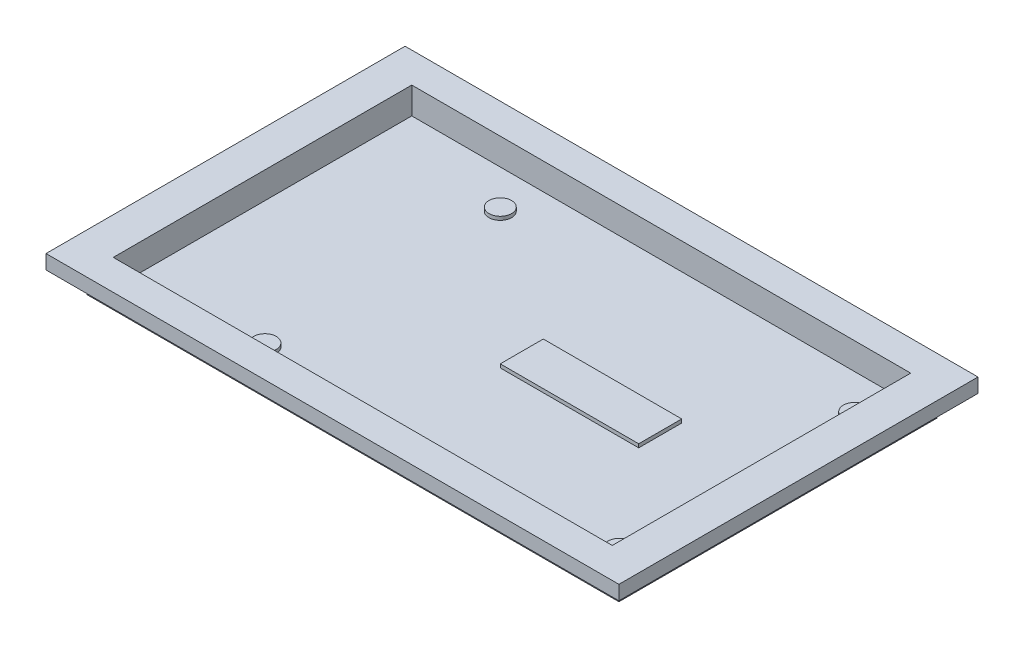
ISO-10303-21;
HEADER;
FILE_DESCRIPTION(('STEP AP214'),'2;1');
FILE_NAME('part.step','',(''),(''),'','','');
FILE_SCHEMA(('AUTOMOTIVE_DESIGN { 1 0 10303 214 1 1 1 1 }'));
ENDSEC;
DATA;
#1=APPLICATION_CONTEXT('core data for automotive mechanical design processes');
#2=APPLICATION_PROTOCOL_DEFINITION('international standard','automotive_design',2000,#1);
#3=PRODUCT_CONTEXT('',#1,'mechanical');
#4=PRODUCT('Part','Part','',(#3));
#5=PRODUCT_RELATED_PRODUCT_CATEGORY('part','',(#4));
#6=PRODUCT_DEFINITION_FORMATION('','',#4);
#7=PRODUCT_DEFINITION_CONTEXT('part definition',#1,'design');
#8=PRODUCT_DEFINITION('design','',#6,#7);
#9=PRODUCT_DEFINITION_SHAPE('','',#8);
#10=(LENGTH_UNIT() NAMED_UNIT(*) SI_UNIT(.MILLI.,.METRE.));
#11=(NAMED_UNIT(*) PLANE_ANGLE_UNIT() SI_UNIT($,.RADIAN.));
#12=(NAMED_UNIT(*) SI_UNIT($,.STERADIAN.) SOLID_ANGLE_UNIT());
#13=UNCERTAINTY_MEASURE_WITH_UNIT(LENGTH_MEASURE(1.E-05),#10,'distance_accuracy_value','');
#14=(GEOMETRIC_REPRESENTATION_CONTEXT(3) GLOBAL_UNCERTAINTY_ASSIGNED_CONTEXT((#13)) GLOBAL_UNIT_ASSIGNED_CONTEXT((#10,
#11,#12)) REPRESENTATION_CONTEXT('',''));
#15=CARTESIAN_POINT('',(0.,0.,0.));
#16=DIRECTION('',(0.,0.,1.));
#17=DIRECTION('',(1.,0.,0.));
#18=AXIS2_PLACEMENT_3D('',#15,#16,#17);
#19=CARTESIAN_POINT('',(0.,0.,0.));
#20=DIRECTION('',(0.,-1.,0.));
#21=DIRECTION('',(0.,0.,-1.));
#22=AXIS2_PLACEMENT_3D('',#19,#20,#21);
#23=PLANE('',#22);
#24=DIRECTION('',(0.,0.,1.));
#25=VECTOR('',#24,1.);
#26=CARTESIAN_POINT('',(2.3,0.,-40.3));
#27=LINE('',#26,#25);
#28=CARTESIAN_POINT('',(2.3,0.,-38.));
#29=VERTEX_POINT('',#28);
#30=CARTESIAN_POINT('',(2.3,0.,-2.3));
#31=VERTEX_POINT('',#30);
#32=EDGE_CURVE('E57',#29,#31,#27,.T.);
#33=ORIENTED_EDGE('',*,*,#32,.F.);
#34=DIRECTION('',(1.,0.,0.));
#35=VECTOR('',#34,1.);
#36=CARTESIAN_POINT('',(0.,0.,-38.));
#37=LINE('',#36,#35);
#38=CARTESIAN_POINT('',(62.,0.,-38.));
#39=VERTEX_POINT('',#38);
#40=EDGE_CURVE('E147',#29,#39,#37,.T.);
#41=ORIENTED_EDGE('',*,*,#40,.T.);
#42=DIRECTION('',(0.,0.,1.));
#43=VECTOR('',#42,1.);
#44=CARTESIAN_POINT('',(62.,0.,-40.3));
#45=LINE('',#44,#43);
#46=CARTESIAN_POINT('',(62.,0.,-2.3));
#47=VERTEX_POINT('',#46);
#48=EDGE_CURVE('E296',#39,#47,#45,.T.);
#49=ORIENTED_EDGE('',*,*,#48,.T.);
#50=DIRECTION('',(1.,0.,0.));
#51=VECTOR('',#50,1.);
#52=CARTESIAN_POINT('',(0.,0.,-2.3));
#53=LINE('',#52,#51);
#54=EDGE_CURVE('E160',#31,#47,#53,.T.);
#55=ORIENTED_EDGE('',*,*,#54,.F.);
#56=EDGE_LOOP('',(#33,#41,#49,#55));
#57=FACE_BOUND('',#56,.T.);
#58=ADVANCED_FACE('F34',(#57),#23,.T.);
#59=CARTESIAN_POINT('',(2.3,0.,-40.3));
#60=DIRECTION('',(1.,0.,0.));
#61=DIRECTION('',(0.,0.,-1.));
#62=AXIS2_PLACEMENT_3D('',#59,#60,#61);
#63=PLANE('',#62);
#64=DIRECTION('',(0.,1.,0.));
#65=VECTOR('',#64,1.);
#66=CARTESIAN_POINT('',(2.3,0.,-38.));
#67=LINE('',#66,#65);
#68=CARTESIAN_POINT('',(2.3,2.4,-38.));
#69=VERTEX_POINT('',#68);
#70=EDGE_CURVE('E149',#29,#69,#67,.T.);
#71=ORIENTED_EDGE('',*,*,#70,.F.);
#72=ORIENTED_EDGE('',*,*,#32,.T.);
#73=DIRECTION('',(0.,1.,0.));
#74=VECTOR('',#73,1.);
#75=CARTESIAN_POINT('',(2.3,0.,-2.3));
#76=LINE('',#75,#74);
#77=CARTESIAN_POINT('',(2.3,2.4,-2.3));
#78=VERTEX_POINT('',#77);
#79=EDGE_CURVE('E177',#31,#78,#76,.T.);
#80=ORIENTED_EDGE('',*,*,#79,.T.);
#81=DIRECTION('',(0.,0.,1.));
#82=VECTOR('',#81,1.);
#83=CARTESIAN_POINT('',(2.3,2.4,-40.3));
#84=LINE('',#83,#82);
#85=EDGE_CURVE('E156',#69,#78,#84,.T.);
#86=ORIENTED_EDGE('',*,*,#85,.F.);
#87=EDGE_LOOP('',(#71,#72,#80,#86));
#88=FACE_BOUND('',#87,.T.);
#89=ADVANCED_FACE('F155',(#88),#63,.F.);
#90=CARTESIAN_POINT('',(62.,0.,-40.3));
#91=DIRECTION('',(1.,0.,0.));
#92=DIRECTION('',(0.,0.,-1.));
#93=AXIS2_PLACEMENT_3D('',#90,#91,#92);
#94=PLANE('',#93);
#95=ORIENTED_EDGE('',*,*,#48,.F.);
#96=DIRECTION('',(0.,1.,0.));
#97=VECTOR('',#96,1.);
#98=CARTESIAN_POINT('',(62.,0.,-38.));
#99=LINE('',#98,#97);
#100=CARTESIAN_POINT('',(62.,2.4,-38.));
#101=VERTEX_POINT('',#100);
#102=EDGE_CURVE('E151',#39,#101,#99,.T.);
#103=ORIENTED_EDGE('',*,*,#102,.T.);
#104=DIRECTION('',(0.,0.,1.));
#105=VECTOR('',#104,1.);
#106=CARTESIAN_POINT('',(62.,2.4,-40.3));
#107=LINE('',#106,#105);
#108=CARTESIAN_POINT('',(62.,2.4,-2.3));
#109=VERTEX_POINT('',#108);
#110=EDGE_CURVE('E165',#101,#109,#107,.T.);
#111=ORIENTED_EDGE('',*,*,#110,.T.);
#112=DIRECTION('',(0.,1.,0.));
#113=VECTOR('',#112,1.);
#114=CARTESIAN_POINT('',(62.,0.,-2.3));
#115=LINE('',#114,#113);
#116=EDGE_CURVE('E170',#47,#109,#115,.T.);
#117=ORIENTED_EDGE('',*,*,#116,.F.);
#118=EDGE_LOOP('',(#95,#103,#111,#117));
#119=FACE_BOUND('',#118,.T.);
#120=ADVANCED_FACE('F344',(#119),#94,.T.);
#121=CARTESIAN_POINT('',(0.,4.,0.));
#122=DIRECTION('',(0.,0.,-1.));
#123=DIRECTION('',(-1.,0.,0.));
#124=AXIS2_PLACEMENT_3D('',#121,#122,#123);
#125=PLANE('',#124);
#126=DIRECTION('',(1.,0.,0.));
#127=VECTOR('',#126,1.);
#128=CARTESIAN_POINT('',(0.,2.4,0.));
#129=LINE('',#128,#127);
#130=CARTESIAN_POINT('',(0.,2.4,0.));
#131=VERTEX_POINT('',#130);
#132=CARTESIAN_POINT('',(64.3,2.4,0.));
#133=VERTEX_POINT('',#132);
#134=EDGE_CURVE('E171',#131,#133,#129,.T.);
#135=ORIENTED_EDGE('',*,*,#134,.T.);
#136=DIRECTION('',(0.,-1.,0.));
#137=VECTOR('',#136,1.);
#138=CARTESIAN_POINT('',(64.3,4.,0.));
#139=LINE('',#138,#137);
#140=CARTESIAN_POINT('',(64.3,4.,0.));
#141=VERTEX_POINT('',#140);
#142=EDGE_CURVE('E42',#141,#133,#139,.T.);
#143=ORIENTED_EDGE('',*,*,#142,.F.);
#144=DIRECTION('',(1.,0.,0.));
#145=VECTOR('',#144,1.);
#146=CARTESIAN_POINT('',(0.,4.,0.));
#147=LINE('',#146,#145);
#148=CARTESIAN_POINT('',(0.,4.,0.));
#149=VERTEX_POINT('',#148);
#150=EDGE_CURVE('E269',#149,#141,#147,.T.);
#151=ORIENTED_EDGE('',*,*,#150,.F.);
#152=DIRECTION('',(0.,-1.,0.));
#153=VECTOR('',#152,1.);
#154=CARTESIAN_POINT('',(0.,4.,0.));
#155=LINE('',#154,#153);
#156=EDGE_CURVE('E11',#149,#131,#155,.T.);
#157=ORIENTED_EDGE('',*,*,#156,.T.);
#158=EDGE_LOOP('',(#135,#143,#151,#157));
#159=FACE_BOUND('',#158,.T.);
#160=ADVANCED_FACE('F290',(#159),#125,.F.);
#161=CARTESIAN_POINT('',(0.,4.,-40.3));
#162=DIRECTION('',(0.,0.,1.));
#163=DIRECTION('',(1.,0.,0.));
#164=AXIS2_PLACEMENT_3D('',#161,#162,#163);
#165=PLANE('',#164);
#166=DIRECTION('',(0.,-1.,0.));
#167=VECTOR('',#166,1.);
#168=CARTESIAN_POINT('',(64.3,4.,-40.3));
#169=LINE('',#168,#167);
#170=CARTESIAN_POINT('',(64.3,4.,-40.3));
#171=VERTEX_POINT('',#170);
#172=CARTESIAN_POINT('',(64.3,2.4,-40.3));
#173=VERTEX_POINT('',#172);
#174=EDGE_CURVE('E278',#171,#173,#169,.T.);
#175=ORIENTED_EDGE('',*,*,#174,.T.);
#176=DIRECTION('',(1.,0.,0.));
#177=VECTOR('',#176,1.);
#178=CARTESIAN_POINT('',(0.,2.4,-40.3));
#179=LINE('',#178,#177);
#180=CARTESIAN_POINT('',(0.,2.4,-40.3));
#181=VERTEX_POINT('',#180);
#182=EDGE_CURVE('E161',#181,#173,#179,.T.);
#183=ORIENTED_EDGE('',*,*,#182,.F.);
#184=DIRECTION('',(0.,-1.,0.));
#185=VECTOR('',#184,1.);
#186=CARTESIAN_POINT('',(0.,4.,-40.3));
#187=LINE('',#186,#185);
#188=CARTESIAN_POINT('',(0.,4.,-40.3));
#189=VERTEX_POINT('',#188);
#190=EDGE_CURVE('E275',#189,#181,#187,.T.);
#191=ORIENTED_EDGE('',*,*,#190,.F.);
#192=DIRECTION('',(-1.,0.,0.));
#193=VECTOR('',#192,1.);
#194=CARTESIAN_POINT('',(0.,4.,-40.3));
#195=LINE('',#194,#193);
#196=EDGE_CURVE('E273',#171,#189,#195,.T.);
#197=ORIENTED_EDGE('',*,*,#196,.F.);
#198=EDGE_LOOP('',(#175,#183,#191,#197));
#199=FACE_BOUND('',#198,.T.);
#200=ADVANCED_FACE('F305',(#199),#165,.F.);
#201=CARTESIAN_POINT('',(64.3,4.,0.));
#202=DIRECTION('',(-1.,0.,0.));
#203=DIRECTION('',(0.,0.,1.));
#204=AXIS2_PLACEMENT_3D('',#201,#202,#203);
#205=PLANE('',#204);
#206=DIRECTION('',(0.,0.,1.));
#207=VECTOR('',#206,1.);
#208=CARTESIAN_POINT('',(64.3,2.4,-40.3));
#209=LINE('',#208,#207);
#210=EDGE_CURVE('E288',#173,#133,#209,.T.);
#211=ORIENTED_EDGE('',*,*,#210,.F.);
#212=ORIENTED_EDGE('',*,*,#174,.F.);
#213=DIRECTION('',(0.,0.,-1.));
#214=VECTOR('',#213,1.);
#215=CARTESIAN_POINT('',(64.3,4.,0.));
#216=LINE('',#215,#214);
#217=EDGE_CURVE('E271',#141,#171,#216,.T.);
#218=ORIENTED_EDGE('',*,*,#217,.F.);
#219=ORIENTED_EDGE('',*,*,#142,.T.);
#220=EDGE_LOOP('',(#211,#212,#218,#219));
#221=FACE_BOUND('',#220,.T.);
#222=ADVANCED_FACE('F285',(#221),#205,.F.);
#223=CARTESIAN_POINT('',(0.,4.,0.));
#224=DIRECTION('',(1.,0.,0.));
#225=DIRECTION('',(0.,0.,-1.));
#226=AXIS2_PLACEMENT_3D('',#223,#224,#225);
#227=PLANE('',#226);
#228=DIRECTION('',(0.,0.,1.));
#229=VECTOR('',#228,1.);
#230=CARTESIAN_POINT('',(0.,2.4,-40.3));
#231=LINE('',#230,#229);
#232=EDGE_CURVE('E163',#181,#131,#231,.T.);
#233=ORIENTED_EDGE('',*,*,#232,.T.);
#234=ORIENTED_EDGE('',*,*,#156,.F.);
#235=DIRECTION('',(0.,0.,1.));
#236=VECTOR('',#235,1.);
#237=CARTESIAN_POINT('',(0.,4.,0.));
#238=LINE('',#237,#236);
#239=EDGE_CURVE('E260',#189,#149,#238,.T.);
#240=ORIENTED_EDGE('',*,*,#239,.F.);
#241=ORIENTED_EDGE('',*,*,#190,.T.);
#242=EDGE_LOOP('',(#233,#234,#240,#241));
#243=FACE_BOUND('',#242,.T.);
#244=ADVANCED_FACE('F36',(#243),#227,.F.);
#245=CARTESIAN_POINT('',(0.,1.,0.));
#246=DIRECTION('',(0.,1.,0.));
#247=DIRECTION('',(0.,0.,1.));
#248=AXIS2_PLACEMENT_3D('',#245,#246,#247);
#249=PLANE('',#248);
#250=CARTESIAN_POINT('',(58.15,1.,-32.61));
#251=DIRECTION('',(0.,1.,0.));
#252=DIRECTION('',(0.,0.,1.));
#253=AXIS2_PLACEMENT_3D('',#250,#251,#252);
#254=CIRCLE('',#253,1.27);
#255=CARTESIAN_POINT('',(58.15,1.,-31.34));
#256=VERTEX_POINT('',#255);
#257=EDGE_CURVE('E209',#256,#256,#254,.T.);
#258=ORIENTED_EDGE('',*,*,#257,.F.);
#259=EDGE_LOOP('',(#258));
#260=FACE_BOUND('',#259,.T.);
#261=CARTESIAN_POINT('',(58.15,1.,-6.194));
#262=DIRECTION('',(0.,1.,0.));
#263=DIRECTION('',(0.,0.,1.));
#264=AXIS2_PLACEMENT_3D('',#261,#262,#263);
#265=CIRCLE('',#264,1.27);
#266=CARTESIAN_POINT('',(58.15,1.,-4.924));
#267=VERTEX_POINT('',#266);
#268=EDGE_CURVE('E213',#267,#267,#265,.T.);
#269=ORIENTED_EDGE('',*,*,#268,.F.);
#270=EDGE_LOOP('',(#269));
#271=FACE_BOUND('',#270,.T.);
#272=CARTESIAN_POINT('',(18.374,1.,-6.194));
#273=DIRECTION('',(0.,1.,0.));
#274=DIRECTION('',(0.,0.,1.));
#275=AXIS2_PLACEMENT_3D('',#272,#273,#274);
#276=CIRCLE('',#275,1.27);
#277=CARTESIAN_POINT('',(18.374,1.,-4.924));
#278=VERTEX_POINT('',#277);
#279=EDGE_CURVE('E219',#278,#278,#276,.T.);
#280=ORIENTED_EDGE('',*,*,#279,.F.);
#281=EDGE_LOOP('',(#280));
#282=FACE_BOUND('',#281,.T.);
#283=CARTESIAN_POINT('',(18.374,1.,-32.61));
#284=DIRECTION('',(0.,1.,0.));
#285=DIRECTION('',(0.,0.,1.));
#286=AXIS2_PLACEMENT_3D('',#283,#284,#285);
#287=CIRCLE('',#286,1.27);
#288=CARTESIAN_POINT('',(18.374,1.,-31.34));
#289=VERTEX_POINT('',#288);
#290=EDGE_CURVE('E225',#289,#289,#287,.T.);
#291=ORIENTED_EDGE('',*,*,#290,.F.);
#292=EDGE_LOOP('',(#291));
#293=FACE_BOUND('',#292,.T.);
#294=DIRECTION('',(1.,0.,0.));
#295=VECTOR('',#294,1.);
#296=CARTESIAN_POINT('',(0.,1.,-36.9));
#297=LINE('',#296,#295);
#298=CARTESIAN_POINT('',(4.14999999999999,1.,-36.9));
#299=VERTEX_POINT('',#298);
#300=CARTESIAN_POINT('',(60.15,1.,-36.9));
#301=VERTEX_POINT('',#300);
#302=EDGE_CURVE('E234',#299,#301,#297,.T.);
#303=ORIENTED_EDGE('',*,*,#302,.F.);
#304=DIRECTION('',(0.,0.,1.));
#305=VECTOR('',#304,1.);
#306=CARTESIAN_POINT('',(4.15,1.,0.));
#307=LINE('',#306,#305);
#308=CARTESIAN_POINT('',(4.15,1.,-3.4));
#309=VERTEX_POINT('',#308);
#310=EDGE_CURVE('E237',#299,#309,#307,.T.);
#311=ORIENTED_EDGE('',*,*,#310,.T.);
#312=DIRECTION('',(1.,0.,0.));
#313=VECTOR('',#312,1.);
#314=CARTESIAN_POINT('',(0.,1.,-3.4));
#315=LINE('',#314,#313);
#316=CARTESIAN_POINT('',(60.15,1.,-3.4));
#317=VERTEX_POINT('',#316);
#318=EDGE_CURVE('E241',#309,#317,#315,.T.);
#319=ORIENTED_EDGE('',*,*,#318,.T.);
#320=DIRECTION('',(0.,0.,1.));
#321=VECTOR('',#320,1.);
#322=CARTESIAN_POINT('',(60.15,1.,0.));
#323=LINE('',#322,#321);
#324=EDGE_CURVE('E244',#301,#317,#323,.T.);
#325=ORIENTED_EDGE('',*,*,#324,.F.);
#326=EDGE_LOOP('',(#303,#311,#319,#325));
#327=FACE_BOUND('',#326,.T.);
#328=DIRECTION('',(1.,0.,0.));
#329=VECTOR('',#328,1.);
#330=CARTESIAN_POINT('',(33.614,1.,-17.37));
#331=LINE('',#330,#329);
#332=CARTESIAN_POINT('',(33.614,1.,-17.37));
#333=VERTEX_POINT('',#332);
#334=CARTESIAN_POINT('',(49.15,1.,-17.37));
#335=VERTEX_POINT('',#334);
#336=EDGE_CURVE('E194',#333,#335,#331,.T.);
#337=ORIENTED_EDGE('',*,*,#336,.F.);
#338=DIRECTION('',(0.,0.,1.));
#339=VECTOR('',#338,1.);
#340=CARTESIAN_POINT('',(33.614,1.,-22.196));
#341=LINE('',#340,#339);
#342=CARTESIAN_POINT('',(33.614,1.,-22.196));
#343=VERTEX_POINT('',#342);
#344=EDGE_CURVE('E179',#343,#333,#341,.T.);
#345=ORIENTED_EDGE('',*,*,#344,.F.);
#346=DIRECTION('',(-1.,0.,0.));
#347=VECTOR('',#346,1.);
#348=CARTESIAN_POINT('',(33.614,1.,-22.196));
#349=LINE('',#348,#347);
#350=CARTESIAN_POINT('',(49.15,1.,-22.196));
#351=VERTEX_POINT('',#350);
#352=EDGE_CURVE('E185',#351,#343,#349,.T.);
#353=ORIENTED_EDGE('',*,*,#352,.F.);
#354=DIRECTION('',(0.,0.,-1.));
#355=VECTOR('',#354,1.);
#356=CARTESIAN_POINT('',(49.15,1.,-22.196));
#357=LINE('',#356,#355);
#358=EDGE_CURVE('E196',#335,#351,#357,.T.);
#359=ORIENTED_EDGE('',*,*,#358,.F.);
#360=EDGE_LOOP('',(#337,#345,#353,#359));
#361=FACE_BOUND('',#360,.T.);
#362=ADVANCED_FACE('F312',(#260,#271,#282,#293,#327,#361),#249,.T.);
#363=CARTESIAN_POINT('',(0.,4.,0.));
#364=DIRECTION('',(0.,-1.,0.));
#365=DIRECTION('',(0.,0.,-1.));
#366=AXIS2_PLACEMENT_3D('',#363,#364,#365);
#367=PLANE('',#366);
#368=ORIENTED_EDGE('',*,*,#239,.T.);
#369=ORIENTED_EDGE('',*,*,#150,.T.);
#370=ORIENTED_EDGE('',*,*,#217,.T.);
#371=ORIENTED_EDGE('',*,*,#196,.T.);
#372=EDGE_LOOP('',(#368,#369,#370,#371));
#373=FACE_BOUND('',#372,.T.);
#374=DIRECTION('',(1.,0.,0.));
#375=VECTOR('',#374,1.);
#376=CARTESIAN_POINT('',(0.,4.,-36.9));
#377=LINE('',#376,#375);
#378=CARTESIAN_POINT('',(4.14999999999999,4.,-36.9));
#379=VERTEX_POINT('',#378);
#380=CARTESIAN_POINT('',(60.15,4.,-36.9));
#381=VERTEX_POINT('',#380);
#382=EDGE_CURVE('E231',#379,#381,#377,.T.);
#383=ORIENTED_EDGE('',*,*,#382,.T.);
#384=DIRECTION('',(0.,0.,1.));
#385=VECTOR('',#384,1.);
#386=CARTESIAN_POINT('',(60.15,4.,0.));
#387=LINE('',#386,#385);
#388=CARTESIAN_POINT('',(60.15,4.,-3.4));
#389=VERTEX_POINT('',#388);
#390=EDGE_CURVE('E238',#381,#389,#387,.T.);
#391=ORIENTED_EDGE('',*,*,#390,.T.);
#392=DIRECTION('',(1.,0.,0.));
#393=VECTOR('',#392,1.);
#394=CARTESIAN_POINT('',(0.,4.,-3.4));
#395=LINE('',#394,#393);
#396=CARTESIAN_POINT('',(4.15,4.,-3.4));
#397=VERTEX_POINT('',#396);
#398=EDGE_CURVE('E252',#397,#389,#395,.T.);
#399=ORIENTED_EDGE('',*,*,#398,.F.);
#400=DIRECTION('',(0.,0.,1.));
#401=VECTOR('',#400,1.);
#402=CARTESIAN_POINT('',(4.15,4.,0.));
#403=LINE('',#402,#401);
#404=EDGE_CURVE('E249',#379,#397,#403,.T.);
#405=ORIENTED_EDGE('',*,*,#404,.F.);
#406=EDGE_LOOP('',(#383,#391,#399,#405));
#407=FACE_BOUND('',#406,.T.);
#408=ADVANCED_FACE('F308',(#373,#407),#367,.F.);
#409=CARTESIAN_POINT('',(0.,1.,-36.9));
#410=DIRECTION('',(0.,0.,1.));
#411=DIRECTION('',(1.,0.,0.));
#412=AXIS2_PLACEMENT_3D('',#409,#410,#411);
#413=PLANE('',#412);
#414=ORIENTED_EDGE('',*,*,#382,.F.);
#415=DIRECTION('',(0.,1.,0.));
#416=VECTOR('',#415,1.);
#417=CARTESIAN_POINT('',(4.14999999999999,1.,-36.9));
#418=LINE('',#417,#416);
#419=EDGE_CURVE('E246',#299,#379,#418,.T.);
#420=ORIENTED_EDGE('',*,*,#419,.F.);
#421=ORIENTED_EDGE('',*,*,#302,.T.);
#422=DIRECTION('',(0.,1.,0.));
#423=VECTOR('',#422,1.);
#424=CARTESIAN_POINT('',(60.15,1.,-36.9));
#425=LINE('',#424,#423);
#426=EDGE_CURVE('E257',#301,#381,#425,.T.);
#427=ORIENTED_EDGE('',*,*,#426,.T.);
#428=EDGE_LOOP('',(#414,#420,#421,#427));
#429=FACE_BOUND('',#428,.T.);
#430=ADVANCED_FACE('F311',(#429),#413,.T.);
#431=CARTESIAN_POINT('',(60.15,1.,0.));
#432=DIRECTION('',(-1.,0.,0.));
#433=DIRECTION('',(0.,0.,1.));
#434=AXIS2_PLACEMENT_3D('',#431,#432,#433);
#435=PLANE('',#434);
#436=ORIENTED_EDGE('',*,*,#390,.F.);
#437=ORIENTED_EDGE('',*,*,#426,.F.);
#438=ORIENTED_EDGE('',*,*,#324,.T.);
#439=DIRECTION('',(0.,1.,0.));
#440=VECTOR('',#439,1.);
#441=CARTESIAN_POINT('',(60.15,1.,-3.4));
#442=LINE('',#441,#440);
#443=EDGE_CURVE('E261',#317,#389,#442,.T.);
#444=ORIENTED_EDGE('',*,*,#443,.T.);
#445=EDGE_LOOP('',(#436,#437,#438,#444));
#446=FACE_BOUND('',#445,.T.);
#447=ADVANCED_FACE('F326',(#446),#435,.T.);
#448=CARTESIAN_POINT('',(0.,1.,-3.4));
#449=DIRECTION('',(0.,0.,1.));
#450=DIRECTION('',(1.,0.,0.));
#451=AXIS2_PLACEMENT_3D('',#448,#449,#450);
#452=PLANE('',#451);
#453=ORIENTED_EDGE('',*,*,#398,.T.);
#454=ORIENTED_EDGE('',*,*,#443,.F.);
#455=ORIENTED_EDGE('',*,*,#318,.F.);
#456=DIRECTION('',(0.,1.,0.));
#457=VECTOR('',#456,1.);
#458=CARTESIAN_POINT('',(4.15,1.,-3.4));
#459=LINE('',#458,#457);
#460=EDGE_CURVE('E263',#309,#397,#459,.T.);
#461=ORIENTED_EDGE('',*,*,#460,.T.);
#462=EDGE_LOOP('',(#453,#454,#455,#461));
#463=FACE_BOUND('',#462,.T.);
#464=ADVANCED_FACE('F329',(#463),#452,.F.);
#465=CARTESIAN_POINT('',(4.15,1.,0.));
#466=DIRECTION('',(-1.,0.,0.));
#467=DIRECTION('',(0.,0.,1.));
#468=AXIS2_PLACEMENT_3D('',#465,#466,#467);
#469=PLANE('',#468);
#470=ORIENTED_EDGE('',*,*,#404,.T.);
#471=ORIENTED_EDGE('',*,*,#460,.F.);
#472=ORIENTED_EDGE('',*,*,#310,.F.);
#473=ORIENTED_EDGE('',*,*,#419,.T.);
#474=EDGE_LOOP('',(#470,#471,#472,#473));
#475=FACE_BOUND('',#474,.T.);
#476=ADVANCED_FACE('F321',(#475),#469,.F.);
#477=CARTESIAN_POINT('',(18.374,1.4,-32.61));
#478=DIRECTION('',(0.,-1.,0.));
#479=DIRECTION('',(0.,0.,-1.));
#480=AXIS2_PLACEMENT_3D('',#477,#478,#479);
#481=CYLINDRICAL_SURFACE('',#480,1.27);
#482=CARTESIAN_POINT('',(18.374,1.4,-32.61));
#483=DIRECTION('',(0.,1.,0.));
#484=DIRECTION('',(0.,0.,1.));
#485=AXIS2_PLACEMENT_3D('',#482,#483,#484);
#486=CIRCLE('',#485,1.27);
#487=CARTESIAN_POINT('',(18.374,1.4,-31.34));
#488=VERTEX_POINT('',#487);
#489=EDGE_CURVE('E228',#488,#488,#486,.T.);
#490=ORIENTED_EDGE('',*,*,#489,.F.);
#491=EDGE_LOOP('',(#490));
#492=FACE_BOUND('',#491,.T.);
#493=ORIENTED_EDGE('',*,*,#290,.T.);
#494=EDGE_LOOP('',(#493));
#495=FACE_BOUND('',#494,.T.);
#496=ADVANCED_FACE('F336',(#492,#495),#481,.T.);
#497=CARTESIAN_POINT('',(18.374,1.4,-32.61));
#498=DIRECTION('',(0.,1.,0.));
#499=DIRECTION('',(0.,0.,1.));
#500=AXIS2_PLACEMENT_3D('',#497,#498,#499);
#501=PLANE('',#500);
#502=ORIENTED_EDGE('',*,*,#489,.T.);
#503=EDGE_LOOP('',(#502));
#504=FACE_BOUND('',#503,.T.);
#505=ADVANCED_FACE('F411',(#504),#501,.T.);
#506=CARTESIAN_POINT('',(18.374,1.4,-6.194));
#507=DIRECTION('',(0.,-1.,0.));
#508=DIRECTION('',(0.,0.,-1.));
#509=AXIS2_PLACEMENT_3D('',#506,#507,#508);
#510=CYLINDRICAL_SURFACE('',#509,1.27);
#511=CARTESIAN_POINT('',(18.374,1.4,-6.194));
#512=DIRECTION('',(0.,1.,0.));
#513=DIRECTION('',(0.,0.,1.));
#514=AXIS2_PLACEMENT_3D('',#511,#512,#513);
#515=CIRCLE('',#514,1.27);
#516=CARTESIAN_POINT('',(18.374,1.4,-4.924));
#517=VERTEX_POINT('',#516);
#518=EDGE_CURVE('E222',#517,#517,#515,.T.);
#519=ORIENTED_EDGE('',*,*,#518,.F.);
#520=EDGE_LOOP('',(#519));
#521=FACE_BOUND('',#520,.T.);
#522=ORIENTED_EDGE('',*,*,#279,.T.);
#523=EDGE_LOOP('',(#522));
#524=FACE_BOUND('',#523,.T.);
#525=ADVANCED_FACE('F407',(#521,#524),#510,.T.);
#526=CARTESIAN_POINT('',(18.374,1.4,-6.194));
#527=DIRECTION('',(0.,1.,0.));
#528=DIRECTION('',(0.,0.,1.));
#529=AXIS2_PLACEMENT_3D('',#526,#527,#528);
#530=PLANE('',#529);
#531=ORIENTED_EDGE('',*,*,#518,.T.);
#532=EDGE_LOOP('',(#531));
#533=FACE_BOUND('',#532,.T.);
#534=ADVANCED_FACE('F403',(#533),#530,.T.);
#535=CARTESIAN_POINT('',(58.15,1.4,-6.194));
#536=DIRECTION('',(0.,-1.,0.));
#537=DIRECTION('',(0.,0.,-1.));
#538=AXIS2_PLACEMENT_3D('',#535,#536,#537);
#539=CYLINDRICAL_SURFACE('',#538,1.27);
#540=CARTESIAN_POINT('',(58.15,1.4,-6.194));
#541=DIRECTION('',(0.,1.,0.));
#542=DIRECTION('',(0.,0.,1.));
#543=AXIS2_PLACEMENT_3D('',#540,#541,#542);
#544=CIRCLE('',#543,1.27);
#545=CARTESIAN_POINT('',(58.15,1.4,-4.924));
#546=VERTEX_POINT('',#545);
#547=EDGE_CURVE('E216',#546,#546,#544,.T.);
#548=ORIENTED_EDGE('',*,*,#547,.F.);
#549=EDGE_LOOP('',(#548));
#550=FACE_BOUND('',#549,.T.);
#551=ORIENTED_EDGE('',*,*,#268,.T.);
#552=EDGE_LOOP('',(#551));
#553=FACE_BOUND('',#552,.T.);
#554=ADVANCED_FACE('F399',(#550,#553),#539,.T.);
#555=CARTESIAN_POINT('',(58.15,1.4,-6.194));
#556=DIRECTION('',(0.,1.,0.));
#557=DIRECTION('',(0.,0.,1.));
#558=AXIS2_PLACEMENT_3D('',#555,#556,#557);
#559=PLANE('',#558);
#560=ORIENTED_EDGE('',*,*,#547,.T.);
#561=EDGE_LOOP('',(#560));
#562=FACE_BOUND('',#561,.T.);
#563=ADVANCED_FACE('F395',(#562),#559,.T.);
#564=CARTESIAN_POINT('',(58.15,1.4,-32.61));
#565=DIRECTION('',(0.,-1.,0.));
#566=DIRECTION('',(0.,0.,-1.));
#567=AXIS2_PLACEMENT_3D('',#564,#565,#566);
#568=CYLINDRICAL_SURFACE('',#567,1.27);
#569=CARTESIAN_POINT('',(58.15,1.4,-32.61));
#570=DIRECTION('',(0.,1.,0.));
#571=DIRECTION('',(0.,0.,1.));
#572=AXIS2_PLACEMENT_3D('',#569,#570,#571);
#573=CIRCLE('',#572,1.27);
#574=CARTESIAN_POINT('',(58.15,1.4,-31.34));
#575=VERTEX_POINT('',#574);
#576=EDGE_CURVE('E210',#575,#575,#573,.T.);
#577=ORIENTED_EDGE('',*,*,#576,.F.);
#578=EDGE_LOOP('',(#577));
#579=FACE_BOUND('',#578,.T.);
#580=ORIENTED_EDGE('',*,*,#257,.T.);
#581=EDGE_LOOP('',(#580));
#582=FACE_BOUND('',#581,.T.);
#583=ADVANCED_FACE('F391',(#579,#582),#568,.T.);
#584=CARTESIAN_POINT('',(58.15,1.4,-32.61));
#585=DIRECTION('',(0.,1.,0.));
#586=DIRECTION('',(0.,0.,1.));
#587=AXIS2_PLACEMENT_3D('',#584,#585,#586);
#588=PLANE('',#587);
#589=ORIENTED_EDGE('',*,*,#576,.T.);
#590=EDGE_LOOP('',(#589));
#591=FACE_BOUND('',#590,.T.);
#592=ADVANCED_FACE('F387',(#591),#588,.T.);
#593=CARTESIAN_POINT('',(33.614,1.4,-22.196));
#594=DIRECTION('',(1.,0.,0.));
#595=DIRECTION('',(0.,0.,-1.));
#596=AXIS2_PLACEMENT_3D('',#593,#594,#595);
#597=PLANE('',#596);
#598=ORIENTED_EDGE('',*,*,#344,.T.);
#599=DIRECTION('',(0.,-1.,0.));
#600=VECTOR('',#599,1.);
#601=CARTESIAN_POINT('',(33.614,1.4,-17.37));
#602=LINE('',#601,#600);
#603=CARTESIAN_POINT('',(33.614,1.4,-17.37));
#604=VERTEX_POINT('',#603);
#605=EDGE_CURVE('E207',#604,#333,#602,.T.);
#606=ORIENTED_EDGE('',*,*,#605,.F.);
#607=DIRECTION('',(0.,0.,1.));
#608=VECTOR('',#607,1.);
#609=CARTESIAN_POINT('',(33.614,1.4,-22.196));
#610=LINE('',#609,#608);
#611=CARTESIAN_POINT('',(33.614,1.4,-22.196));
#612=VERTEX_POINT('',#611);
#613=EDGE_CURVE('E181',#612,#604,#610,.T.);
#614=ORIENTED_EDGE('',*,*,#613,.F.);
#615=DIRECTION('',(0.,-1.,0.));
#616=VECTOR('',#615,1.);
#617=CARTESIAN_POINT('',(33.614,1.4,-22.196));
#618=LINE('',#617,#616);
#619=EDGE_CURVE('E191',#612,#343,#618,.T.);
#620=ORIENTED_EDGE('',*,*,#619,.T.);
#621=EDGE_LOOP('',(#598,#606,#614,#620));
#622=FACE_BOUND('',#621,.T.);
#623=ADVANCED_FACE('F383',(#622),#597,.F.);
#624=CARTESIAN_POINT('',(33.614,1.4,-17.37));
#625=DIRECTION('',(0.,0.,-1.));
#626=DIRECTION('',(-1.,0.,0.));
#627=AXIS2_PLACEMENT_3D('',#624,#625,#626);
#628=PLANE('',#627);
#629=ORIENTED_EDGE('',*,*,#336,.T.);
#630=DIRECTION('',(0.,-1.,0.));
#631=VECTOR('',#630,1.);
#632=CARTESIAN_POINT('',(49.15,1.4,-17.37));
#633=LINE('',#632,#631);
#634=CARTESIAN_POINT('',(49.15,1.4,-17.37));
#635=VERTEX_POINT('',#634);
#636=EDGE_CURVE('E204',#635,#335,#633,.T.);
#637=ORIENTED_EDGE('',*,*,#636,.F.);
#638=DIRECTION('',(1.,0.,0.));
#639=VECTOR('',#638,1.);
#640=CARTESIAN_POINT('',(33.614,1.4,-17.37));
#641=LINE('',#640,#639);
#642=EDGE_CURVE('E184',#604,#635,#641,.T.);
#643=ORIENTED_EDGE('',*,*,#642,.F.);
#644=ORIENTED_EDGE('',*,*,#605,.T.);
#645=EDGE_LOOP('',(#629,#637,#643,#644));
#646=FACE_BOUND('',#645,.T.);
#647=ADVANCED_FACE('F379',(#646),#628,.F.);
#648=CARTESIAN_POINT('',(49.15,1.4,-22.196));
#649=DIRECTION('',(-1.,0.,0.));
#650=DIRECTION('',(0.,0.,1.));
#651=AXIS2_PLACEMENT_3D('',#648,#649,#650);
#652=PLANE('',#651);
#653=ORIENTED_EDGE('',*,*,#358,.T.);
#654=DIRECTION('',(0.,-1.,0.));
#655=VECTOR('',#654,1.);
#656=CARTESIAN_POINT('',(49.15,1.4,-22.196));
#657=LINE('',#656,#655);
#658=CARTESIAN_POINT('',(49.15,1.4,-22.196));
#659=VERTEX_POINT('',#658);
#660=EDGE_CURVE('E202',#659,#351,#657,.T.);
#661=ORIENTED_EDGE('',*,*,#660,.F.);
#662=DIRECTION('',(0.,0.,-1.));
#663=VECTOR('',#662,1.);
#664=CARTESIAN_POINT('',(49.15,1.4,-22.196));
#665=LINE('',#664,#663);
#666=EDGE_CURVE('E187',#635,#659,#665,.T.);
#667=ORIENTED_EDGE('',*,*,#666,.F.);
#668=ORIENTED_EDGE('',*,*,#636,.T.);
#669=EDGE_LOOP('',(#653,#661,#667,#668));
#670=FACE_BOUND('',#669,.T.);
#671=ADVANCED_FACE('F375',(#670),#652,.F.);
#672=CARTESIAN_POINT('',(33.614,1.4,-22.196));
#673=DIRECTION('',(0.,0.,1.));
#674=DIRECTION('',(1.,0.,0.));
#675=AXIS2_PLACEMENT_3D('',#672,#673,#674);
#676=PLANE('',#675);
#677=ORIENTED_EDGE('',*,*,#352,.T.);
#678=ORIENTED_EDGE('',*,*,#619,.F.);
#679=DIRECTION('',(-1.,0.,0.));
#680=VECTOR('',#679,1.);
#681=CARTESIAN_POINT('',(33.614,1.4,-22.196));
#682=LINE('',#681,#680);
#683=EDGE_CURVE('E189',#659,#612,#682,.T.);
#684=ORIENTED_EDGE('',*,*,#683,.F.);
#685=ORIENTED_EDGE('',*,*,#660,.T.);
#686=EDGE_LOOP('',(#677,#678,#684,#685));
#687=FACE_BOUND('',#686,.T.);
#688=ADVANCED_FACE('F371',(#687),#676,.F.);
#689=CARTESIAN_POINT('',(0.,1.4,0.));
#690=DIRECTION('',(0.,1.,0.));
#691=DIRECTION('',(0.,0.,1.));
#692=AXIS2_PLACEMENT_3D('',#689,#690,#691);
#693=PLANE('',#692);
#694=ORIENTED_EDGE('',*,*,#613,.T.);
#695=ORIENTED_EDGE('',*,*,#642,.T.);
#696=ORIENTED_EDGE('',*,*,#666,.T.);
#697=ORIENTED_EDGE('',*,*,#683,.T.);
#698=EDGE_LOOP('',(#694,#695,#696,#697));
#699=FACE_BOUND('',#698,.T.);
#700=ADVANCED_FACE('F367',(#699),#693,.T.);
#701=CARTESIAN_POINT('',(0.,2.4,-2.3));
#702=DIRECTION('',(0.,-1.,0.));
#703=DIRECTION('',(0.,0.,-1.));
#704=AXIS2_PLACEMENT_3D('',#701,#702,#703);
#705=PLANE('',#704);
#706=DIRECTION('',(1.,0.,0.));
#707=VECTOR('',#706,1.);
#708=CARTESIAN_POINT('',(0.,2.4,-38.));
#709=LINE('',#708,#707);
#710=EDGE_CURVE('E49',#69,#101,#709,.T.);
#711=ORIENTED_EDGE('',*,*,#710,.F.);
#712=ORIENTED_EDGE('',*,*,#85,.T.);
#713=DIRECTION('',(1.,0.,0.));
#714=VECTOR('',#713,1.);
#715=CARTESIAN_POINT('',(0.,2.4,-2.3));
#716=LINE('',#715,#714);
#717=EDGE_CURVE('E174',#78,#109,#716,.T.);
#718=ORIENTED_EDGE('',*,*,#717,.T.);
#719=ORIENTED_EDGE('',*,*,#110,.F.);
#720=EDGE_LOOP('',(#711,#712,#718,#719));
#721=FACE_BOUND('',#720,.T.);
#722=ORIENTED_EDGE('',*,*,#134,.F.);
#723=ORIENTED_EDGE('',*,*,#232,.F.);
#724=ORIENTED_EDGE('',*,*,#182,.T.);
#725=ORIENTED_EDGE('',*,*,#210,.T.);
#726=EDGE_LOOP('',(#722,#723,#724,#725));
#727=FACE_BOUND('',#726,.T.);
#728=ADVANCED_FACE('F294',(#721,#727),#705,.T.);
#729=CARTESIAN_POINT('',(0.,0.,-2.3));
#730=DIRECTION('',(0.,0.,1.));
#731=DIRECTION('',(1.,0.,0.));
#732=AXIS2_PLACEMENT_3D('',#729,#730,#731);
#733=PLANE('',#732);
#734=ORIENTED_EDGE('',*,*,#54,.T.);
#735=ORIENTED_EDGE('',*,*,#116,.T.);
#736=ORIENTED_EDGE('',*,*,#717,.F.);
#737=ORIENTED_EDGE('',*,*,#79,.F.);
#738=EDGE_LOOP('',(#734,#735,#736,#737));
#739=FACE_BOUND('',#738,.T.);
#740=ADVANCED_FACE('F361',(#739),#733,.T.);
#741=CARTESIAN_POINT('',(0.,0.,-38.));
#742=DIRECTION('',(0.,0.,-1.));
#743=DIRECTION('',(1.,0.,0.));
#744=AXIS2_PLACEMENT_3D('',#741,#742,#743);
#745=PLANE('',#744);
#746=ORIENTED_EDGE('',*,*,#40,.F.);
#747=ORIENTED_EDGE('',*,*,#70,.T.);
#748=ORIENTED_EDGE('',*,*,#710,.T.);
#749=ORIENTED_EDGE('',*,*,#102,.F.);
#750=EDGE_LOOP('',(#746,#747,#748,#749));
#751=FACE_BOUND('',#750,.T.);
#752=ADVANCED_FACE('F148',(#751),#745,.T.);
#753=CLOSED_SHELL('',(#58,#89,#120,#160,#200,#222,#244,#362,#408,#430,#447,#464,#476,#496,#505,
#525,#534,#554,#563,#583,#592,#623,#647,#671,#688,#700,#728,#740,#752));
#754=MANIFOLD_SOLID_BREP('B2',#753);
#755=ADVANCED_BREP_SHAPE_REPRESENTATION('',(#18,#754),#14);
#756=SHAPE_DEFINITION_REPRESENTATION(#9,#755);
ENDSEC;
END-ISO-10303-21;
